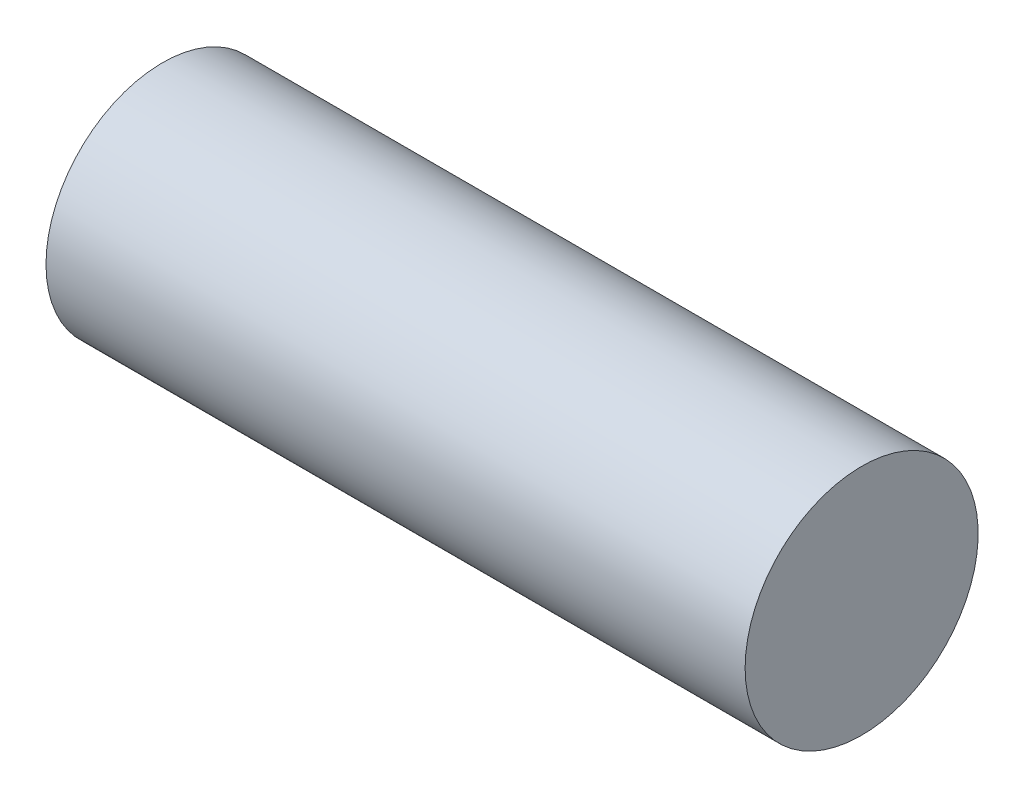
ISO-10303-21;
HEADER;
FILE_DESCRIPTION(('STEP AP214'),'2;1');
FILE_NAME('part.step','',(''),(''),'','','');
FILE_SCHEMA(('AUTOMOTIVE_DESIGN { 1 0 10303 214 1 1 1 1 }'));
ENDSEC;
DATA;
#1=APPLICATION_CONTEXT('core data for automotive mechanical design processes');
#2=APPLICATION_PROTOCOL_DEFINITION('international standard','automotive_design',2000,#1);
#3=PRODUCT_CONTEXT('',#1,'mechanical');
#4=PRODUCT('Part','Part','',(#3));
#5=PRODUCT_RELATED_PRODUCT_CATEGORY('part','',(#4));
#6=PRODUCT_DEFINITION_FORMATION('','',#4);
#7=PRODUCT_DEFINITION_CONTEXT('part definition',#1,'design');
#8=PRODUCT_DEFINITION('design','',#6,#7);
#9=PRODUCT_DEFINITION_SHAPE('','',#8);
#10=(LENGTH_UNIT() NAMED_UNIT(*) SI_UNIT(.MILLI.,.METRE.));
#11=(NAMED_UNIT(*) PLANE_ANGLE_UNIT() SI_UNIT($,.RADIAN.));
#12=(NAMED_UNIT(*) SI_UNIT($,.STERADIAN.) SOLID_ANGLE_UNIT());
#13=UNCERTAINTY_MEASURE_WITH_UNIT(LENGTH_MEASURE(1.E-05),#10,'distance_accuracy_value','');
#14=(GEOMETRIC_REPRESENTATION_CONTEXT(3) GLOBAL_UNCERTAINTY_ASSIGNED_CONTEXT((#13)) GLOBAL_UNIT_ASSIGNED_CONTEXT((#10,
#11,#12)) REPRESENTATION_CONTEXT('',''));
#15=CARTESIAN_POINT('',(0.,0.,0.));
#16=DIRECTION('',(0.,0.,1.));
#17=DIRECTION('',(1.,0.,0.));
#18=AXIS2_PLACEMENT_3D('',#15,#16,#17);
#19=CARTESIAN_POINT('',(-10.2802650882785,7.65151515151515,0.));
#20=DIRECTION('',(-1.,0.,0.));
#21=DIRECTION('',(0.,0.,1.));
#22=AXIS2_PLACEMENT_3D('',#19,#20,#21);
#23=PLANE('',#22);
#24=CARTESIAN_POINT('',(-10.2802650882785,7.65151515151515,0.));
#25=DIRECTION('',(-1.,0.,0.));
#26=DIRECTION('',(0.,0.,1.));
#27=AXIS2_PLACEMENT_3D('',#24,#25,#26);
#28=CIRCLE('',#27,5.);
#29=CARTESIAN_POINT('',(-10.2802650882785,7.65151515151515,5.));
#30=VERTEX_POINT('',#29);
#31=EDGE_CURVE('E10',#30,#30,#28,.T.);
#32=ORIENTED_EDGE('',*,*,#31,.T.);
#33=EDGE_LOOP('',(#32));
#34=FACE_BOUND('',#33,.T.);
#35=ADVANCED_FACE('F31',(#34),#23,.T.);
#36=CARTESIAN_POINT('',(-10.2802650882785,7.65151515151515,0.));
#37=DIRECTION('',(-1.,0.,0.));
#38=DIRECTION('',(0.,0.,1.));
#39=AXIS2_PLACEMENT_3D('',#36,#37,#38);
#40=CYLINDRICAL_SURFACE('',#39,5.);
#41=CARTESIAN_POINT('',(19.7197349117215,7.65151515151515,0.));
#42=DIRECTION('',(-1.,0.,0.));
#43=DIRECTION('',(0.,0.,1.));
#44=AXIS2_PLACEMENT_3D('',#41,#42,#43);
#45=CIRCLE('',#44,5.);
#46=CARTESIAN_POINT('',(19.7197349117215,7.65151515151515,5.));
#47=VERTEX_POINT('',#46);
#48=EDGE_CURVE('E37',#47,#47,#45,.T.);
#49=ORIENTED_EDGE('',*,*,#48,.T.);
#50=EDGE_LOOP('',(#49));
#51=FACE_BOUND('',#50,.T.);
#52=ORIENTED_EDGE('',*,*,#31,.F.);
#53=EDGE_LOOP('',(#52));
#54=FACE_BOUND('',#53,.T.);
#55=ADVANCED_FACE('F43',(#51,#54),#40,.T.);
#56=CARTESIAN_POINT('',(19.7197349117215,7.65151515151515,0.));
#57=DIRECTION('',(1.,0.,0.));
#58=DIRECTION('',(0.,0.,-1.));
#59=AXIS2_PLACEMENT_3D('',#56,#57,#58);
#60=PLANE('',#59);
#61=ORIENTED_EDGE('',*,*,#48,.F.);
#62=EDGE_LOOP('',(#61));
#63=FACE_BOUND('',#62,.T.);
#64=ADVANCED_FACE('F46',(#63),#60,.T.);
#65=CLOSED_SHELL('',(#35,#55,#64));
#66=MANIFOLD_SOLID_BREP('B2',#65);
#67=ADVANCED_BREP_SHAPE_REPRESENTATION('',(#18,#66),#14);
#68=SHAPE_DEFINITION_REPRESENTATION(#9,#67);
ENDSEC;
END-ISO-10303-21;
